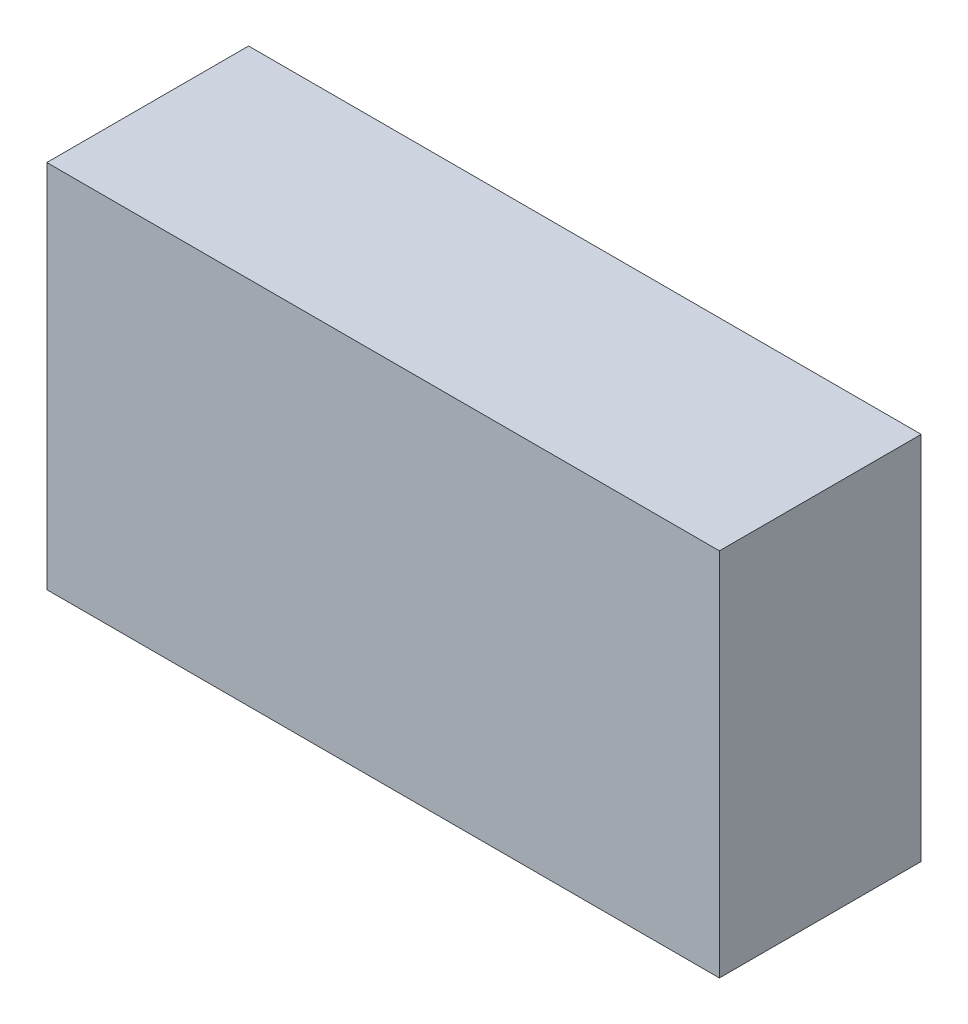
ISO-10303-21;
HEADER;
FILE_DESCRIPTION(('STEP AP214'),'2;1');
FILE_NAME('part.step','',(''),(''),'','','');
FILE_SCHEMA(('AUTOMOTIVE_DESIGN { 1 0 10303 214 1 1 1 1 }'));
ENDSEC;
DATA;
#1=APPLICATION_CONTEXT('core data for automotive mechanical design processes');
#2=APPLICATION_PROTOCOL_DEFINITION('international standard','automotive_design',2000,#1);
#3=PRODUCT_CONTEXT('',#1,'mechanical');
#4=PRODUCT('Part','Part','',(#3));
#5=PRODUCT_RELATED_PRODUCT_CATEGORY('part','',(#4));
#6=PRODUCT_DEFINITION_FORMATION('','',#4);
#7=PRODUCT_DEFINITION_CONTEXT('part definition',#1,'design');
#8=PRODUCT_DEFINITION('design','',#6,#7);
#9=PRODUCT_DEFINITION_SHAPE('','',#8);
#10=(LENGTH_UNIT() NAMED_UNIT(*) SI_UNIT(.MILLI.,.METRE.));
#11=(NAMED_UNIT(*) PLANE_ANGLE_UNIT() SI_UNIT($,.RADIAN.));
#12=(NAMED_UNIT(*) SI_UNIT($,.STERADIAN.) SOLID_ANGLE_UNIT());
#13=UNCERTAINTY_MEASURE_WITH_UNIT(LENGTH_MEASURE(1.E-05),#10,'distance_accuracy_value','');
#14=(GEOMETRIC_REPRESENTATION_CONTEXT(3) GLOBAL_UNCERTAINTY_ASSIGNED_CONTEXT((#13)) GLOBAL_UNIT_ASSIGNED_CONTEXT((#10,
#11,#12)) REPRESENTATION_CONTEXT('',''));
#15=CARTESIAN_POINT('',(0.,0.,0.));
#16=DIRECTION('',(0.,0.,1.));
#17=DIRECTION('',(1.,0.,0.));
#18=AXIS2_PLACEMENT_3D('',#15,#16,#17);
#19=CARTESIAN_POINT('',(50.,-27.5,30.));
#20=DIRECTION('',(-1.,0.,0.));
#21=DIRECTION('',(0.,0.,1.));
#22=AXIS2_PLACEMENT_3D('',#19,#20,#21);
#23=PLANE('',#22);
#24=DIRECTION('',(0.,1.,0.));
#25=VECTOR('',#24,1.);
#26=CARTESIAN_POINT('',(50.,-27.5,0.));
#27=LINE('',#26,#25);
#28=CARTESIAN_POINT('',(50.,-27.5,0.));
#29=VERTEX_POINT('',#28);
#30=CARTESIAN_POINT('',(50.,27.5,0.));
#31=VERTEX_POINT('',#30);
#32=EDGE_CURVE('E113',#29,#31,#27,.T.);
#33=ORIENTED_EDGE('',*,*,#32,.T.);
#34=DIRECTION('',(0.,0.,-1.));
#35=VECTOR('',#34,1.);
#36=CARTESIAN_POINT('',(50.,27.5,30.));
#37=LINE('',#36,#35);
#38=CARTESIAN_POINT('',(50.,27.5,30.));
#39=VERTEX_POINT('',#38);
#40=EDGE_CURVE('E11',#39,#31,#37,.T.);
#41=ORIENTED_EDGE('',*,*,#40,.F.);
#42=DIRECTION('',(0.,1.,0.));
#43=VECTOR('',#42,1.);
#44=CARTESIAN_POINT('',(50.,-27.5,30.));
#45=LINE('',#44,#43);
#46=CARTESIAN_POINT('',(50.,-27.5,30.));
#47=VERTEX_POINT('',#46);
#48=EDGE_CURVE('E97',#47,#39,#45,.T.);
#49=ORIENTED_EDGE('',*,*,#48,.F.);
#50=DIRECTION('',(0.,0.,-1.));
#51=VECTOR('',#50,1.);
#52=CARTESIAN_POINT('',(50.,-27.5,30.));
#53=LINE('',#52,#51);
#54=EDGE_CURVE('E109',#47,#29,#53,.T.);
#55=ORIENTED_EDGE('',*,*,#54,.T.);
#56=EDGE_LOOP('',(#33,#41,#49,#55));
#57=FACE_BOUND('',#56,.T.);
#58=ADVANCED_FACE('F45',(#57),#23,.F.);
#59=CARTESIAN_POINT('',(-50.,27.5,30.));
#60=DIRECTION('',(0.,-1.,0.));
#61=DIRECTION('',(0.,0.,-1.));
#62=AXIS2_PLACEMENT_3D('',#59,#60,#61);
#63=PLANE('',#62);
#64=DIRECTION('',(-1.,0.,0.));
#65=VECTOR('',#64,1.);
#66=CARTESIAN_POINT('',(-50.,27.5,0.));
#67=LINE('',#66,#65);
#68=CARTESIAN_POINT('',(-50.,27.5,0.));
#69=VERTEX_POINT('',#68);
#70=EDGE_CURVE('E102',#31,#69,#67,.T.);
#71=ORIENTED_EDGE('',*,*,#70,.T.);
#72=DIRECTION('',(0.,0.,-1.));
#73=VECTOR('',#72,1.);
#74=CARTESIAN_POINT('',(-50.,27.5,30.));
#75=LINE('',#74,#73);
#76=CARTESIAN_POINT('',(-50.,27.5,30.));
#77=VERTEX_POINT('',#76);
#78=EDGE_CURVE('E54',#77,#69,#75,.T.);
#79=ORIENTED_EDGE('',*,*,#78,.F.);
#80=DIRECTION('',(-1.,0.,0.));
#81=VECTOR('',#80,1.);
#82=CARTESIAN_POINT('',(-50.,27.5,30.));
#83=LINE('',#82,#81);
#84=EDGE_CURVE('E92',#39,#77,#83,.T.);
#85=ORIENTED_EDGE('',*,*,#84,.F.);
#86=ORIENTED_EDGE('',*,*,#40,.T.);
#87=EDGE_LOOP('',(#71,#79,#85,#86));
#88=FACE_BOUND('',#87,.T.);
#89=ADVANCED_FACE('F101',(#88),#63,.F.);
#90=CARTESIAN_POINT('',(-50.,-27.5,30.));
#91=DIRECTION('',(1.,0.,0.));
#92=DIRECTION('',(0.,0.,-1.));
#93=AXIS2_PLACEMENT_3D('',#90,#91,#92);
#94=PLANE('',#93);
#95=DIRECTION('',(0.,-1.,0.));
#96=VECTOR('',#95,1.);
#97=CARTESIAN_POINT('',(-50.,-27.5,0.));
#98=LINE('',#97,#96);
#99=CARTESIAN_POINT('',(-50.,-27.5,0.));
#100=VERTEX_POINT('',#99);
#101=EDGE_CURVE('E79',#69,#100,#98,.T.);
#102=ORIENTED_EDGE('',*,*,#101,.T.);
#103=DIRECTION('',(0.,0.,-1.));
#104=VECTOR('',#103,1.);
#105=CARTESIAN_POINT('',(-50.,-27.5,30.));
#106=LINE('',#105,#104);
#107=CARTESIAN_POINT('',(-50.,-27.5,30.));
#108=VERTEX_POINT('',#107);
#109=EDGE_CURVE('E104',#108,#100,#106,.T.);
#110=ORIENTED_EDGE('',*,*,#109,.F.);
#111=DIRECTION('',(0.,-1.,0.));
#112=VECTOR('',#111,1.);
#113=CARTESIAN_POINT('',(-50.,-27.5,30.));
#114=LINE('',#113,#112);
#115=EDGE_CURVE('E95',#77,#108,#114,.T.);
#116=ORIENTED_EDGE('',*,*,#115,.F.);
#117=ORIENTED_EDGE('',*,*,#78,.T.);
#118=EDGE_LOOP('',(#102,#110,#116,#117));
#119=FACE_BOUND('',#118,.T.);
#120=ADVANCED_FACE('F105',(#119),#94,.F.);
#121=CARTESIAN_POINT('',(-50.,-27.5,30.));
#122=DIRECTION('',(0.,1.,0.));
#123=DIRECTION('',(0.,0.,1.));
#124=AXIS2_PLACEMENT_3D('',#121,#122,#123);
#125=PLANE('',#124);
#126=DIRECTION('',(1.,0.,0.));
#127=VECTOR('',#126,1.);
#128=CARTESIAN_POINT('',(-50.,-27.5,0.));
#129=LINE('',#128,#127);
#130=EDGE_CURVE('E85',#100,#29,#129,.T.);
#131=ORIENTED_EDGE('',*,*,#130,.T.);
#132=ORIENTED_EDGE('',*,*,#54,.F.);
#133=DIRECTION('',(1.,0.,0.));
#134=VECTOR('',#133,1.);
#135=CARTESIAN_POINT('',(-50.,-27.5,30.));
#136=LINE('',#135,#134);
#137=EDGE_CURVE('E62',#108,#47,#136,.T.);
#138=ORIENTED_EDGE('',*,*,#137,.F.);
#139=ORIENTED_EDGE('',*,*,#109,.T.);
#140=EDGE_LOOP('',(#131,#132,#138,#139));
#141=FACE_BOUND('',#140,.T.);
#142=ADVANCED_FACE('F126',(#141),#125,.F.);
#143=CARTESIAN_POINT('',(0.,0.,30.));
#144=DIRECTION('',(0.,0.,-1.));
#145=DIRECTION('',(-1.,0.,0.));
#146=AXIS2_PLACEMENT_3D('',#143,#144,#145);
#147=PLANE('',#146);
#148=ORIENTED_EDGE('',*,*,#48,.T.);
#149=ORIENTED_EDGE('',*,*,#84,.T.);
#150=ORIENTED_EDGE('',*,*,#115,.T.);
#151=ORIENTED_EDGE('',*,*,#137,.T.);
#152=EDGE_LOOP('',(#148,#149,#150,#151));
#153=FACE_BOUND('',#152,.T.);
#154=ADVANCED_FACE('F93',(#153),#147,.F.);
#155=CARTESIAN_POINT('',(0.,0.,0.));
#156=DIRECTION('',(0.,0.,-1.));
#157=DIRECTION('',(-1.,0.,0.));
#158=AXIS2_PLACEMENT_3D('',#155,#156,#157);
#159=PLANE('',#158);
#160=ORIENTED_EDGE('',*,*,#32,.F.);
#161=ORIENTED_EDGE('',*,*,#130,.F.);
#162=ORIENTED_EDGE('',*,*,#101,.F.);
#163=ORIENTED_EDGE('',*,*,#70,.F.);
#164=EDGE_LOOP('',(#160,#161,#162,#163));
#165=FACE_BOUND('',#164,.T.);
#166=ADVANCED_FACE('F129',(#165),#159,.T.);
#167=CLOSED_SHELL('',(#58,#89,#120,#142,#154,#166));
#168=MANIFOLD_SOLID_BREP('B2',#167);
#169=ADVANCED_BREP_SHAPE_REPRESENTATION('',(#18,#168),#14);
#170=SHAPE_DEFINITION_REPRESENTATION(#9,#169);
ENDSEC;
END-ISO-10303-21;
